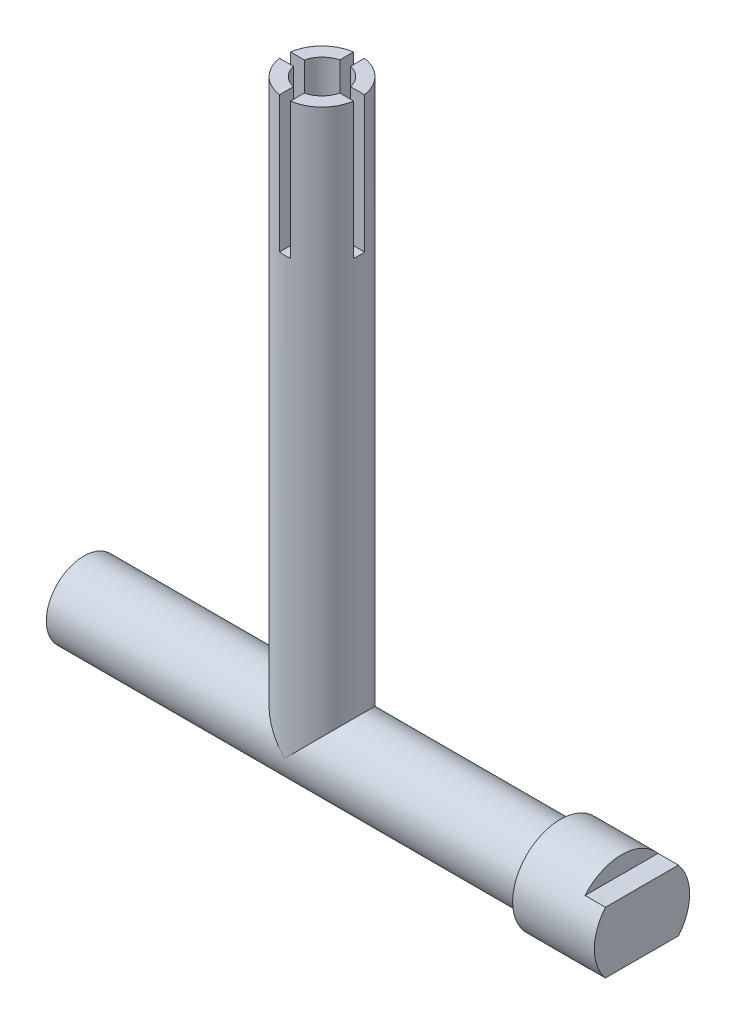
ISO-10303-21;
HEADER;
FILE_DESCRIPTION(('STEP AP214'),'2;1');
FILE_NAME('part.step','',(''),(''),'','','');
FILE_SCHEMA(('AUTOMOTIVE_DESIGN { 1 0 10303 214 1 1 1 1 }'));
ENDSEC;
DATA;
#1=APPLICATION_CONTEXT('core data for automotive mechanical design processes');
#2=APPLICATION_PROTOCOL_DEFINITION('international standard','automotive_design',2000,#1);
#3=PRODUCT_CONTEXT('',#1,'mechanical');
#4=PRODUCT('Part','Part','',(#3));
#5=PRODUCT_RELATED_PRODUCT_CATEGORY('part','',(#4));
#6=PRODUCT_DEFINITION_FORMATION('','',#4);
#7=PRODUCT_DEFINITION_CONTEXT('part definition',#1,'design');
#8=PRODUCT_DEFINITION('design','',#6,#7);
#9=PRODUCT_DEFINITION_SHAPE('','',#8);
#10=(LENGTH_UNIT() NAMED_UNIT(*) SI_UNIT(.MILLI.,.METRE.));
#11=(NAMED_UNIT(*) PLANE_ANGLE_UNIT() SI_UNIT($,.RADIAN.));
#12=(NAMED_UNIT(*) SI_UNIT($,.STERADIAN.) SOLID_ANGLE_UNIT());
#13=UNCERTAINTY_MEASURE_WITH_UNIT(LENGTH_MEASURE(1.E-05),#10,'distance_accuracy_value','');
#14=(GEOMETRIC_REPRESENTATION_CONTEXT(3) GLOBAL_UNCERTAINTY_ASSIGNED_CONTEXT((#13)) GLOBAL_UNIT_ASSIGNED_CONTEXT((#10,
#11,#12)) REPRESENTATION_CONTEXT('',''));
#15=CARTESIAN_POINT('',(0.,0.,0.));
#16=DIRECTION('',(0.,0.,1.));
#17=DIRECTION('',(1.,0.,0.));
#18=AXIS2_PLACEMENT_3D('',#15,#16,#17);
#19=CARTESIAN_POINT('',(41.,0.,0.));
#20=DIRECTION('',(-1.,0.,0.));
#21=DIRECTION('',(0.,0.,1.));
#22=AXIS2_PLACEMENT_3D('',#19,#20,#21);
#23=CYLINDRICAL_SURFACE('',#22,3.5);
#24=CARTESIAN_POINT('',(35.,0.,0.));
#25=DIRECTION('',(1.,0.,0.));
#26=DIRECTION('',(0.,0.,-1.));
#27=AXIS2_PLACEMENT_3D('',#24,#25,#26);
#28=CIRCLE('',#27,3.5);
#29=CARTESIAN_POINT('',(35.,0.,-3.5));
#30=VERTEX_POINT('',#29);
#31=EDGE_CURVE('E229',#30,#30,#28,.T.);
#32=ORIENTED_EDGE('',*,*,#31,.T.);
#33=EDGE_LOOP('',(#32));
#34=FACE_BOUND('',#33,.T.);
#35=DIRECTION('',(1.,0.,0.));
#36=VECTOR('',#35,1.);
#37=CARTESIAN_POINT('',(39.5,-2.25,2.6809513236909));
#38=LINE('',#37,#36);
#39=CARTESIAN_POINT('',(39.5,-2.25,2.6809513236909));
#40=VERTEX_POINT('',#39);
#41=CARTESIAN_POINT('',(41.,-2.25,2.6809513236909));
#42=VERTEX_POINT('',#41);
#43=EDGE_CURVE('E214',#40,#42,#38,.T.);
#44=ORIENTED_EDGE('',*,*,#43,.T.);
#45=CARTESIAN_POINT('',(41.,0.,0.));
#46=DIRECTION('',(1.,0.,0.));
#47=DIRECTION('',(0.,0.,-1.));
#48=AXIS2_PLACEMENT_3D('',#45,#46,#47);
#49=CIRCLE('',#48,3.5);
#50=CARTESIAN_POINT('',(41.,2.25,2.6809513236909));
#51=VERTEX_POINT('',#50);
#52=EDGE_CURVE('E231',#51,#42,#49,.T.);
#53=ORIENTED_EDGE('',*,*,#52,.F.);
#54=DIRECTION('',(1.,0.,0.));
#55=VECTOR('',#54,1.);
#56=CARTESIAN_POINT('',(39.5,2.25,2.6809513236909));
#57=LINE('',#56,#55);
#58=CARTESIAN_POINT('',(39.5,2.25,2.6809513236909));
#59=VERTEX_POINT('',#58);
#60=EDGE_CURVE('E61',#59,#51,#57,.T.);
#61=ORIENTED_EDGE('',*,*,#60,.F.);
#62=CARTESIAN_POINT('',(39.5,0.,0.));
#63=DIRECTION('',(1.,0.,0.));
#64=DIRECTION('',(0.,0.,-1.));
#65=AXIS2_PLACEMENT_3D('',#62,#63,#64);
#66=CIRCLE('',#65,3.5);
#67=CARTESIAN_POINT('',(39.5,2.25,-2.6809513236909));
#68=VERTEX_POINT('',#67);
#69=EDGE_CURVE('E220',#68,#59,#66,.T.);
#70=ORIENTED_EDGE('',*,*,#69,.F.);
#71=DIRECTION('',(1.,0.,0.));
#72=VECTOR('',#71,1.);
#73=CARTESIAN_POINT('',(39.5,2.25,-2.6809513236909));
#74=LINE('',#73,#72);
#75=CARTESIAN_POINT('',(41.,2.25,-2.6809513236909));
#76=VERTEX_POINT('',#75);
#77=EDGE_CURVE('E226',#68,#76,#74,.T.);
#78=ORIENTED_EDGE('',*,*,#77,.T.);
#79=CARTESIAN_POINT('',(41.,-2.25,-2.6809513236909));
#80=VERTEX_POINT('',#79);
#81=EDGE_CURVE('E235',#80,#76,#49,.T.);
#82=ORIENTED_EDGE('',*,*,#81,.F.);
#83=DIRECTION('',(1.,0.,0.));
#84=VECTOR('',#83,1.);
#85=CARTESIAN_POINT('',(39.5,-2.25,-2.6809513236909));
#86=LINE('',#85,#84);
#87=CARTESIAN_POINT('',(39.5,-2.25,-2.6809513236909));
#88=VERTEX_POINT('',#87);
#89=EDGE_CURVE('E53',#88,#80,#86,.T.);
#90=ORIENTED_EDGE('',*,*,#89,.F.);
#91=CARTESIAN_POINT('',(39.5,0.,0.));
#92=DIRECTION('',(1.,0.,0.));
#93=DIRECTION('',(0.,0.,-1.));
#94=AXIS2_PLACEMENT_3D('',#91,#92,#93);
#95=CIRCLE('',#94,3.5);
#96=EDGE_CURVE('E211',#40,#88,#95,.T.);
#97=ORIENTED_EDGE('',*,*,#96,.F.);
#98=EDGE_LOOP('',(#44,#53,#61,#70,#78,#82,#90,#97));
#99=FACE_BOUND('',#98,.T.);
#100=ADVANCED_FACE('F38',(#34,#99),#23,.T.);
#101=CARTESIAN_POINT('',(41.,0.,0.));
#102=DIRECTION('',(1.,0.,0.));
#103=DIRECTION('',(0.,0.,-1.));
#104=AXIS2_PLACEMENT_3D('',#101,#102,#103);
#105=PLANE('',#104);
#106=ORIENTED_EDGE('',*,*,#52,.T.);
#107=DIRECTION('',(0.,0.,-1.));
#108=VECTOR('',#107,1.);
#109=CARTESIAN_POINT('',(41.,-2.25,0.));
#110=LINE('',#109,#108);
#111=EDGE_CURVE('E207',#42,#80,#110,.T.);
#112=ORIENTED_EDGE('',*,*,#111,.T.);
#113=ORIENTED_EDGE('',*,*,#81,.T.);
#114=DIRECTION('',(0.,0.,-1.));
#115=VECTOR('',#114,1.);
#116=CARTESIAN_POINT('',(41.,2.25,0.));
#117=LINE('',#116,#115);
#118=EDGE_CURVE('E217',#51,#76,#117,.T.);
#119=ORIENTED_EDGE('',*,*,#118,.F.);
#120=EDGE_LOOP('',(#106,#112,#113,#119));
#121=FACE_BOUND('',#120,.T.);
#122=ADVANCED_FACE('F428',(#121),#105,.T.);
#123=CARTESIAN_POINT('',(17.5,42.,0.));
#124=DIRECTION('',(0.,-1.,0.));
#125=DIRECTION('',(0.,0.,-1.));
#126=AXIS2_PLACEMENT_3D('',#123,#124,#125);
#127=CYLINDRICAL_SURFACE('',#126,2.75);
#128=CARTESIAN_POINT('',(17.5,0.,0.));
#129=DIRECTION('',(-0.707106781186548,0.707106781186547,0.));
#130=DIRECTION('',(-0.707106781186548,-0.707106781186547,0.));
#131=AXIS2_PLACEMENT_3D('',#128,#129,#130);
#132=ELLIPSE('',#131,3.88908729652601,2.75);
#133=CARTESIAN_POINT('',(17.5,0.,2.75));
#134=VERTEX_POINT('',#133);
#135=CARTESIAN_POINT('',(17.5,0.,-2.75));
#136=VERTEX_POINT('',#135);
#137=EDGE_CURVE('E320',#134,#136,#132,.T.);
#138=ORIENTED_EDGE('',*,*,#137,.T.);
#139=CARTESIAN_POINT('',(17.5,0.,0.));
#140=DIRECTION('',(-0.707106781186548,-0.707106781186547,0.));
#141=DIRECTION('',(-0.707106781186548,0.707106781186547,0.));
#142=AXIS2_PLACEMENT_3D('',#139,#140,#141);
#143=ELLIPSE('',#142,3.88908729652601,2.75);
#144=EDGE_CURVE('E325',#136,#134,#143,.F.);
#145=ORIENTED_EDGE('',*,*,#144,.T.);
#146=EDGE_LOOP('',(#138,#145));
#147=FACE_BOUND('',#146,.T.);
#148=DIRECTION('',(0.,-1.,0.));
#149=VECTOR('',#148,1.);
#150=CARTESIAN_POINT('',(20.2207535720826,42.,-0.400000000000001));
#151=LINE('',#150,#149);
#152=CARTESIAN_POINT('',(20.2207535720826,32.,-0.400000000000018));
#153=VERTEX_POINT('',#152);
#154=CARTESIAN_POINT('',(20.2207535720826,42.,-0.400000000000001));
#155=VERTEX_POINT('',#154);
#156=EDGE_CURVE('E296',#153,#155,#151,.F.);
#157=ORIENTED_EDGE('',*,*,#156,.F.);
#158=CARTESIAN_POINT('',(17.5,32.,0.));
#159=DIRECTION('',(0.,1.,0.));
#160=DIRECTION('',(0.,0.,1.));
#161=AXIS2_PLACEMENT_3D('',#158,#159,#160);
#162=CIRCLE('',#161,2.75);
#163=CARTESIAN_POINT('',(20.2207535720826,32.,0.39999999999998));
#164=VERTEX_POINT('',#163);
#165=EDGE_CURVE('E282',#164,#153,#162,.T.);
#166=ORIENTED_EDGE('',*,*,#165,.F.);
#167=DIRECTION('',(0.,-1.,0.));
#168=VECTOR('',#167,1.);
#169=CARTESIAN_POINT('',(20.2207535720826,42.,0.399999999999998));
#170=LINE('',#169,#168);
#171=CARTESIAN_POINT('',(20.2207535720826,42.,0.399999999999998));
#172=VERTEX_POINT('',#171);
#173=EDGE_CURVE('E293',#164,#172,#170,.F.);
#174=ORIENTED_EDGE('',*,*,#173,.T.);
#175=CARTESIAN_POINT('',(17.5,42.,0.));
#176=DIRECTION('',(0.,1.,0.));
#177=DIRECTION('',(0.,0.,1.));
#178=AXIS2_PLACEMENT_3D('',#175,#176,#177);
#179=CIRCLE('',#178,2.75);
#180=CARTESIAN_POINT('',(17.9,42.0000000000001,2.72075357208256));
#181=VERTEX_POINT('',#180);
#182=EDGE_CURVE('E312',#181,#172,#179,.T.);
#183=ORIENTED_EDGE('',*,*,#182,.F.);
#184=DIRECTION('',(0.,-1.,0.));
#185=VECTOR('',#184,1.);
#186=CARTESIAN_POINT('',(17.9,42.0000000000001,2.72075357208255));
#187=LINE('',#186,#185);
#188=CARTESIAN_POINT('',(17.9,32.0000000000001,2.72075357208256));
#189=VERTEX_POINT('',#188);
#190=EDGE_CURVE('E290',#181,#189,#187,.T.);
#191=ORIENTED_EDGE('',*,*,#190,.T.);
#192=CARTESIAN_POINT('',(17.1,32.0000000000001,2.72075357208256));
#193=VERTEX_POINT('',#192);
#194=EDGE_CURVE('E261',#193,#189,#162,.T.);
#195=ORIENTED_EDGE('',*,*,#194,.F.);
#196=DIRECTION('',(0.,-1.,0.));
#197=VECTOR('',#196,1.);
#198=CARTESIAN_POINT('',(17.1,42.,2.72075357208255));
#199=LINE('',#198,#197);
#200=CARTESIAN_POINT('',(17.1,42.,2.72075357208255));
#201=VERTEX_POINT('',#200);
#202=EDGE_CURVE('E288',#201,#193,#199,.T.);
#203=ORIENTED_EDGE('',*,*,#202,.F.);
#204=CARTESIAN_POINT('',(14.7792464279174,42.0000000000001,0.399999999999998));
#205=VERTEX_POINT('',#204);
#206=EDGE_CURVE('E311',#205,#201,#179,.T.);
#207=ORIENTED_EDGE('',*,*,#206,.F.);
#208=DIRECTION('',(0.,-1.,0.));
#209=VECTOR('',#208,1.);
#210=CARTESIAN_POINT('',(14.7792464279174,42.0000000000001,0.399999999999998));
#211=LINE('',#210,#209);
#212=CARTESIAN_POINT('',(14.7792464279174,32.,0.39999999999998));
#213=VERTEX_POINT('',#212);
#214=EDGE_CURVE('E285',#205,#213,#211,.T.);
#215=ORIENTED_EDGE('',*,*,#214,.T.);
#216=CARTESIAN_POINT('',(14.7792464279174,32.,-0.400000000000018));
#217=VERTEX_POINT('',#216);
#218=EDGE_CURVE('E281',#217,#213,#162,.T.);
#219=ORIENTED_EDGE('',*,*,#218,.F.);
#220=DIRECTION('',(0.,-1.,0.));
#221=VECTOR('',#220,1.);
#222=CARTESIAN_POINT('',(14.7792464279174,42.0000000000001,-0.400000000000001));
#223=LINE('',#222,#221);
#224=CARTESIAN_POINT('',(14.7792464279174,42.0000000000001,-0.400000000000001));
#225=VERTEX_POINT('',#224);
#226=EDGE_CURVE('E283',#225,#217,#223,.T.);
#227=ORIENTED_EDGE('',*,*,#226,.F.);
#228=CARTESIAN_POINT('',(17.1,42.,-2.72075357208255));
#229=VERTEX_POINT('',#228);
#230=EDGE_CURVE('E395',#229,#225,#179,.T.);
#231=ORIENTED_EDGE('',*,*,#230,.F.);
#232=DIRECTION('',(0.,-1.,0.));
#233=VECTOR('',#232,1.);
#234=CARTESIAN_POINT('',(17.1,42.,-2.72075357208255));
#235=LINE('',#234,#233);
#236=CARTESIAN_POINT('',(17.1,32.,-2.72075357208256));
#237=VERTEX_POINT('',#236);
#238=EDGE_CURVE('E301',#237,#229,#235,.F.);
#239=ORIENTED_EDGE('',*,*,#238,.F.);
#240=CARTESIAN_POINT('',(17.9,32.,-2.72075357208256));
#241=VERTEX_POINT('',#240);
#242=EDGE_CURVE('E380',#241,#237,#162,.T.);
#243=ORIENTED_EDGE('',*,*,#242,.F.);
#244=DIRECTION('',(0.,-1.,0.));
#245=VECTOR('',#244,1.);
#246=CARTESIAN_POINT('',(17.9,42.0000000000001,-2.72075357208255));
#247=LINE('',#246,#245);
#248=CARTESIAN_POINT('',(17.9,42.0000000000001,-2.72075357208255));
#249=VERTEX_POINT('',#248);
#250=EDGE_CURVE('E298',#241,#249,#247,.F.);
#251=ORIENTED_EDGE('',*,*,#250,.T.);
#252=EDGE_CURVE('E316',#155,#249,#179,.T.);
#253=ORIENTED_EDGE('',*,*,#252,.F.);
#254=EDGE_LOOP('',(#157,#166,#174,#183,#191,#195,#203,#207,#215,#219,#227,#231,#239,#243,#251,#253));
#255=FACE_BOUND('',#254,.T.);
#256=ADVANCED_FACE('F378',(#147,#255),#127,.T.);
#257=CARTESIAN_POINT('',(17.5,42.,0.));
#258=DIRECTION('',(0.,1.,0.));
#259=DIRECTION('',(0.,0.,1.));
#260=AXIS2_PLACEMENT_3D('',#257,#258,#259);
#261=PLANE('',#260);
#262=CARTESIAN_POINT('',(17.5,42.,0.));
#263=DIRECTION('',(0.,1.,0.));
#264=DIRECTION('',(0.,0.,1.));
#265=AXIS2_PLACEMENT_3D('',#262,#263,#264);
#266=CIRCLE('',#265,1.75);
#267=CARTESIAN_POINT('',(17.1,42.,-1.70367250374007));
#268=VERTEX_POINT('',#267);
#269=CARTESIAN_POINT('',(15.7963274962599,42.0000000000001,-0.400000000000001));
#270=VERTEX_POINT('',#269);
#271=EDGE_CURVE('E746',#268,#270,#266,.T.);
#272=ORIENTED_EDGE('',*,*,#271,.F.);
#273=DIRECTION('',(0.,0.,-1.));
#274=VECTOR('',#273,1.);
#275=CARTESIAN_POINT('',(17.1,42.,0.));
#276=LINE('',#275,#274);
#277=EDGE_CURVE('E234',#268,#229,#276,.T.);
#278=ORIENTED_EDGE('',*,*,#277,.T.);
#279=ORIENTED_EDGE('',*,*,#230,.T.);
#280=DIRECTION('',(1.,0.,0.));
#281=VECTOR('',#280,1.);
#282=CARTESIAN_POINT('',(0.,42.,-0.400000000000015));
#283=LINE('',#282,#281);
#284=EDGE_CURVE('E264',#225,#270,#283,.T.);
#285=ORIENTED_EDGE('',*,*,#284,.T.);
#286=EDGE_LOOP('',(#272,#278,#279,#285));
#287=FACE_BOUND('',#286,.T.);
#288=ADVANCED_FACE('F482',(#287),#261,.T.);
#289=DIRECTION('',(0.,0.,-1.));
#290=VECTOR('',#289,1.);
#291=CARTESIAN_POINT('',(17.9,42.0000000000001,0.));
#292=LINE('',#291,#290);
#293=CARTESIAN_POINT('',(17.9,42.0000000000001,-1.70367250374008));
#294=VERTEX_POINT('',#293);
#295=EDGE_CURVE('E242',#294,#249,#292,.T.);
#296=ORIENTED_EDGE('',*,*,#295,.F.);
#297=CARTESIAN_POINT('',(19.2036725037401,42.,-0.400000000000001));
#298=VERTEX_POINT('',#297);
#299=EDGE_CURVE('E308',#298,#294,#266,.T.);
#300=ORIENTED_EDGE('',*,*,#299,.F.);
#301=DIRECTION('',(1.,0.,0.));
#302=VECTOR('',#301,1.);
#303=CARTESIAN_POINT('',(0.,42.,-0.400000000000015));
#304=LINE('',#303,#302);
#305=EDGE_CURVE('E276',#298,#155,#304,.T.);
#306=ORIENTED_EDGE('',*,*,#305,.T.);
#307=ORIENTED_EDGE('',*,*,#252,.T.);
#308=EDGE_LOOP('',(#296,#300,#306,#307));
#309=FACE_BOUND('',#308,.T.);
#310=ADVANCED_FACE('F402',(#309),#261,.T.);
#311=ORIENTED_EDGE('',*,*,#206,.T.);
#312=DIRECTION('',(0.,0.,-1.));
#313=VECTOR('',#312,1.);
#314=CARTESIAN_POINT('',(17.1,42.,0.));
#315=LINE('',#314,#313);
#316=CARTESIAN_POINT('',(17.1,42.,1.70367250374008));
#317=VERTEX_POINT('',#316);
#318=EDGE_CURVE('E269',#201,#317,#315,.T.);
#319=ORIENTED_EDGE('',*,*,#318,.T.);
#320=CARTESIAN_POINT('',(15.7963274962599,42.0000000000001,0.399999999999998));
#321=VERTEX_POINT('',#320);
#322=EDGE_CURVE('E303',#321,#317,#266,.T.);
#323=ORIENTED_EDGE('',*,*,#322,.F.);
#324=DIRECTION('',(1.,0.,0.));
#325=VECTOR('',#324,1.);
#326=CARTESIAN_POINT('',(0.,42.,0.399999999999984));
#327=LINE('',#326,#325);
#328=EDGE_CURVE('E267',#205,#321,#327,.T.);
#329=ORIENTED_EDGE('',*,*,#328,.F.);
#330=EDGE_LOOP('',(#311,#319,#323,#329));
#331=FACE_BOUND('',#330,.T.);
#332=ADVANCED_FACE('F491',(#331),#261,.T.);
#333=CARTESIAN_POINT('',(17.5,42.,0.));
#334=DIRECTION('',(0.,1.,0.));
#335=DIRECTION('',(0.,0.,1.));
#336=AXIS2_PLACEMENT_3D('',#333,#334,#335);
#337=CYLINDRICAL_SURFACE('',#336,1.75);
#338=CARTESIAN_POINT('',(17.5,32.,0.));
#339=DIRECTION('',(0.,1.,0.));
#340=DIRECTION('',(0.,0.,1.));
#341=AXIS2_PLACEMENT_3D('',#338,#339,#340);
#342=CIRCLE('',#341,1.75);
#343=CARTESIAN_POINT('',(15.7963274962599,32.,0.39999999999998));
#344=VERTEX_POINT('',#343);
#345=CARTESIAN_POINT('',(15.7963274962599,32.,-0.400000000000018));
#346=VERTEX_POINT('',#345);
#347=EDGE_CURVE('E331',#344,#346,#342,.F.);
#348=ORIENTED_EDGE('',*,*,#347,.F.);
#349=DIRECTION('',(0.,1.,0.));
#350=VECTOR('',#349,1.);
#351=CARTESIAN_POINT('',(15.7963274962599,42.0000000000001,0.399999999999998));
#352=LINE('',#351,#350);
#353=EDGE_CURVE('E11',#344,#321,#352,.T.);
#354=ORIENTED_EDGE('',*,*,#353,.T.);
#355=ORIENTED_EDGE('',*,*,#322,.T.);
#356=DIRECTION('',(0.,1.,0.));
#357=VECTOR('',#356,1.);
#358=CARTESIAN_POINT('',(17.1,42.,1.70367250374008));
#359=LINE('',#358,#357);
#360=CARTESIAN_POINT('',(17.1,32.,1.70367250374008));
#361=VERTEX_POINT('',#360);
#362=EDGE_CURVE('E330',#361,#317,#359,.T.);
#363=ORIENTED_EDGE('',*,*,#362,.F.);
#364=CARTESIAN_POINT('',(17.9,32.,1.70367250374008));
#365=VERTEX_POINT('',#364);
#366=EDGE_CURVE('E328',#365,#361,#342,.F.);
#367=ORIENTED_EDGE('',*,*,#366,.F.);
#368=DIRECTION('',(0.,1.,0.));
#369=VECTOR('',#368,1.);
#370=CARTESIAN_POINT('',(17.9,42.0000000000001,1.70367250374008));
#371=LINE('',#370,#369);
#372=CARTESIAN_POINT('',(17.9,42.0000000000001,1.70367250374008));
#373=VERTEX_POINT('',#372);
#374=EDGE_CURVE('E334',#365,#373,#371,.T.);
#375=ORIENTED_EDGE('',*,*,#374,.T.);
#376=CARTESIAN_POINT('',(19.2036725037401,42.,0.399999999999998));
#377=VERTEX_POINT('',#376);
#378=EDGE_CURVE('E304',#373,#377,#266,.T.);
#379=ORIENTED_EDGE('',*,*,#378,.T.);
#380=DIRECTION('',(0.,1.,0.));
#381=VECTOR('',#380,1.);
#382=CARTESIAN_POINT('',(19.2036725037401,42.,0.399999999999998));
#383=LINE('',#382,#381);
#384=CARTESIAN_POINT('',(19.2036725037401,32.,0.39999999999998));
#385=VERTEX_POINT('',#384);
#386=EDGE_CURVE('E337',#377,#385,#383,.F.);
#387=ORIENTED_EDGE('',*,*,#386,.T.);
#388=CARTESIAN_POINT('',(19.2036725037401,32.,-0.400000000000018));
#389=VERTEX_POINT('',#388);
#390=EDGE_CURVE('E332',#389,#385,#342,.F.);
#391=ORIENTED_EDGE('',*,*,#390,.F.);
#392=DIRECTION('',(0.,1.,0.));
#393=VECTOR('',#392,1.);
#394=CARTESIAN_POINT('',(19.2036725037401,42.,-0.400000000000001));
#395=LINE('',#394,#393);
#396=EDGE_CURVE('E340',#298,#389,#395,.F.);
#397=ORIENTED_EDGE('',*,*,#396,.F.);
#398=ORIENTED_EDGE('',*,*,#299,.T.);
#399=DIRECTION('',(0.,1.,0.));
#400=VECTOR('',#399,1.);
#401=CARTESIAN_POINT('',(17.9,42.0000000000001,-1.70367250374008));
#402=LINE('',#401,#400);
#403=CARTESIAN_POINT('',(17.9,32.,-1.70367250374008));
#404=VERTEX_POINT('',#403);
#405=EDGE_CURVE('E344',#294,#404,#402,.F.);
#406=ORIENTED_EDGE('',*,*,#405,.T.);
#407=CARTESIAN_POINT('',(17.1,32.,-1.70367250374008));
#408=VERTEX_POINT('',#407);
#409=EDGE_CURVE('E343',#408,#404,#342,.F.);
#410=ORIENTED_EDGE('',*,*,#409,.F.);
#411=DIRECTION('',(0.,1.,0.));
#412=VECTOR('',#411,1.);
#413=CARTESIAN_POINT('',(17.1,42.,-1.70367250374007));
#414=LINE('',#413,#412);
#415=EDGE_CURVE('E347',#268,#408,#414,.F.);
#416=ORIENTED_EDGE('',*,*,#415,.F.);
#417=ORIENTED_EDGE('',*,*,#271,.T.);
#418=DIRECTION('',(0.,1.,0.));
#419=VECTOR('',#418,1.);
#420=CARTESIAN_POINT('',(15.7963274962599,42.0000000000001,-0.400000000000001));
#421=LINE('',#420,#419);
#422=EDGE_CURVE('E46',#346,#270,#421,.T.);
#423=ORIENTED_EDGE('',*,*,#422,.F.);
#424=EDGE_LOOP('',(#348,#354,#355,#363,#367,#375,#379,#387,#391,#397,#398,#406,#410,#416,#417,#423));
#425=FACE_BOUND('',#424,.T.);
#426=CARTESIAN_POINT('',(17.5,28.9999999999999,0.));
#427=DIRECTION('',(0.,1.,0.));
#428=DIRECTION('',(0.,0.,1.));
#429=AXIS2_PLACEMENT_3D('',#426,#427,#428);
#430=CIRCLE('',#429,1.75);
#431=CARTESIAN_POINT('',(17.5,28.9999999999999,1.75));
#432=VERTEX_POINT('',#431);
#433=EDGE_CURVE('E307',#432,#432,#430,.T.);
#434=ORIENTED_EDGE('',*,*,#433,.F.);
#435=EDGE_LOOP('',(#434));
#436=FACE_BOUND('',#435,.T.);
#437=ADVANCED_FACE('F367',(#425,#436),#337,.F.);
#438=CARTESIAN_POINT('',(35.,0.,0.));
#439=DIRECTION('',(-1.,0.,0.));
#440=DIRECTION('',(0.,0.,1.));
#441=AXIS2_PLACEMENT_3D('',#438,#439,#440);
#442=CYLINDRICAL_SURFACE('',#441,2.75);
#443=CARTESIAN_POINT('',(0.,0.,0.));
#444=DIRECTION('',(1.,0.,0.));
#445=DIRECTION('',(0.,0.,-1.));
#446=AXIS2_PLACEMENT_3D('',#443,#444,#445);
#447=CIRCLE('',#446,2.75);
#448=CARTESIAN_POINT('',(0.,0.,-2.75));
#449=VERTEX_POINT('',#448);
#450=EDGE_CURVE('E315',#449,#449,#447,.T.);
#451=ORIENTED_EDGE('',*,*,#450,.T.);
#452=EDGE_LOOP('',(#451));
#453=FACE_BOUND('',#452,.T.);
#454=CARTESIAN_POINT('',(35.,0.,0.));
#455=DIRECTION('',(1.,0.,0.));
#456=DIRECTION('',(0.,0.,-1.));
#457=AXIS2_PLACEMENT_3D('',#454,#455,#456);
#458=CIRCLE('',#457,2.75);
#459=CARTESIAN_POINT('',(35.,0.,-2.75));
#460=VERTEX_POINT('',#459);
#461=EDGE_CURVE('E317',#460,#460,#458,.T.);
#462=ORIENTED_EDGE('',*,*,#461,.F.);
#463=EDGE_LOOP('',(#462));
#464=FACE_BOUND('',#463,.T.);
#465=ORIENTED_EDGE('',*,*,#144,.F.);
#466=ORIENTED_EDGE('',*,*,#137,.F.);
#467=EDGE_LOOP('',(#465,#466));
#468=FACE_BOUND('',#467,.T.);
#469=ADVANCED_FACE('F40',(#453,#464,#468),#442,.T.);
#470=CARTESIAN_POINT('',(0.,0.,0.));
#471=DIRECTION('',(1.,0.,0.));
#472=DIRECTION('',(0.,0.,-1.));
#473=AXIS2_PLACEMENT_3D('',#470,#471,#472);
#474=PLANE('',#473);
#475=CARTESIAN_POINT('',(0.,0.,0.));
#476=DIRECTION('',(-1.,0.,0.));
#477=DIRECTION('',(0.,0.,1.));
#478=AXIS2_PLACEMENT_3D('',#475,#476,#477);
#479=CIRCLE('',#478,2.);
#480=CARTESIAN_POINT('',(0.,0.,2.));
#481=VERTEX_POINT('',#480);
#482=EDGE_CURVE('E197',#481,#481,#479,.T.);
#483=ORIENTED_EDGE('',*,*,#482,.F.);
#484=EDGE_LOOP('',(#483));
#485=FACE_BOUND('',#484,.T.);
#486=ORIENTED_EDGE('',*,*,#450,.F.);
#487=EDGE_LOOP('',(#486));
#488=FACE_BOUND('',#487,.T.);
#489=ADVANCED_FACE('F471',(#485,#488),#474,.F.);
#490=DIRECTION('',(1.,0.,0.));
#491=VECTOR('',#490,1.);
#492=CARTESIAN_POINT('',(0.,42.,0.399999999999984));
#493=LINE('',#492,#491);
#494=EDGE_CURVE('E274',#377,#172,#493,.T.);
#495=ORIENTED_EDGE('',*,*,#494,.F.);
#496=ORIENTED_EDGE('',*,*,#378,.F.);
#497=DIRECTION('',(0.,0.,-1.));
#498=VECTOR('',#497,1.);
#499=CARTESIAN_POINT('',(17.9,42.0000000000001,0.));
#500=LINE('',#499,#498);
#501=EDGE_CURVE('E272',#181,#373,#500,.T.);
#502=ORIENTED_EDGE('',*,*,#501,.F.);
#503=ORIENTED_EDGE('',*,*,#182,.T.);
#504=EDGE_LOOP('',(#495,#496,#502,#503));
#505=FACE_BOUND('',#504,.T.);
#506=ADVANCED_FACE('F374',(#505),#261,.T.);
#507=CARTESIAN_POINT('',(17.5,28.9999999999999,0.));
#508=DIRECTION('',(0.,1.,0.));
#509=DIRECTION('',(0.,0.,1.));
#510=AXIS2_PLACEMENT_3D('',#507,#508,#509);
#511=CONICAL_SURFACE('',#510,1.75,1.02974425867665);
#512=CARTESIAN_POINT('',(17.5,27.9484939167017,0.));
#513=VERTEX_POINT('',#512);
#514=VERTEX_LOOP('',#513);
#515=FACE_BOUND('',#514,.T.);
#516=ORIENTED_EDGE('',*,*,#433,.T.);
#517=EDGE_LOOP('',(#516));
#518=FACE_BOUND('',#517,.T.);
#519=ADVANCED_FACE('F490',(#515,#518),#511,.F.);
#520=CARTESIAN_POINT('',(0.,32.,0.));
#521=DIRECTION('',(0.,1.,0.));
#522=DIRECTION('',(0.,0.,1.));
#523=AXIS2_PLACEMENT_3D('',#520,#521,#522);
#524=PLANE('',#523);
#525=ORIENTED_EDGE('',*,*,#194,.T.);
#526=DIRECTION('',(0.,0.,-1.));
#527=VECTOR('',#526,1.);
#528=CARTESIAN_POINT('',(17.9,32.,0.));
#529=LINE('',#528,#527);
#530=EDGE_CURVE('E250',#189,#365,#529,.T.);
#531=ORIENTED_EDGE('',*,*,#530,.T.);
#532=ORIENTED_EDGE('',*,*,#366,.T.);
#533=DIRECTION('',(0.,0.,-1.));
#534=VECTOR('',#533,1.);
#535=CARTESIAN_POINT('',(17.1,32.,0.));
#536=LINE('',#535,#534);
#537=EDGE_CURVE('E247',#193,#361,#536,.T.);
#538=ORIENTED_EDGE('',*,*,#537,.F.);
#539=EDGE_LOOP('',(#525,#531,#532,#538));
#540=FACE_BOUND('',#539,.T.);
#541=ADVANCED_FACE('F424',(#540),#524,.T.);
#542=CARTESIAN_POINT('',(17.1,32.,0.));
#543=DIRECTION('',(1.,0.,0.));
#544=DIRECTION('',(0.,0.,-1.));
#545=AXIS2_PLACEMENT_3D('',#542,#543,#544);
#546=PLANE('',#545);
#547=ORIENTED_EDGE('',*,*,#202,.T.);
#548=ORIENTED_EDGE('',*,*,#537,.T.);
#549=ORIENTED_EDGE('',*,*,#362,.T.);
#550=ORIENTED_EDGE('',*,*,#318,.F.);
#551=EDGE_LOOP('',(#547,#548,#549,#550));
#552=FACE_BOUND('',#551,.T.);
#553=ADVANCED_FACE('F504',(#552),#546,.T.);
#554=CARTESIAN_POINT('',(17.9,32.,0.));
#555=DIRECTION('',(1.,0.,0.));
#556=DIRECTION('',(0.,0.,-1.));
#557=AXIS2_PLACEMENT_3D('',#554,#555,#556);
#558=PLANE('',#557);
#559=ORIENTED_EDGE('',*,*,#501,.T.);
#560=ORIENTED_EDGE('',*,*,#374,.F.);
#561=ORIENTED_EDGE('',*,*,#530,.F.);
#562=ORIENTED_EDGE('',*,*,#190,.F.);
#563=EDGE_LOOP('',(#559,#560,#561,#562));
#564=FACE_BOUND('',#563,.T.);
#565=ADVANCED_FACE('F426',(#564),#558,.F.);
#566=ORIENTED_EDGE('',*,*,#165,.T.);
#567=DIRECTION('',(1.,0.,0.));
#568=VECTOR('',#567,1.);
#569=CARTESIAN_POINT('',(0.,32.,-0.400000000000018));
#570=LINE('',#569,#568);
#571=EDGE_CURVE('E255',#389,#153,#570,.T.);
#572=ORIENTED_EDGE('',*,*,#571,.F.);
#573=ORIENTED_EDGE('',*,*,#390,.T.);
#574=DIRECTION('',(1.,0.,0.));
#575=VECTOR('',#574,1.);
#576=CARTESIAN_POINT('',(0.,32.,0.39999999999998));
#577=LINE('',#576,#575);
#578=EDGE_CURVE('E252',#385,#164,#577,.T.);
#579=ORIENTED_EDGE('',*,*,#578,.T.);
#580=EDGE_LOOP('',(#566,#572,#573,#579));
#581=FACE_BOUND('',#580,.T.);
#582=ADVANCED_FACE('F360',(#581),#524,.T.);
#583=CARTESIAN_POINT('',(0.,32.,0.39999999999998));
#584=DIRECTION('',(0.,0.,1.));
#585=DIRECTION('',(1.,0.,0.));
#586=AXIS2_PLACEMENT_3D('',#583,#584,#585);
#587=PLANE('',#586);
#588=ORIENTED_EDGE('',*,*,#578,.F.);
#589=ORIENTED_EDGE('',*,*,#386,.F.);
#590=ORIENTED_EDGE('',*,*,#494,.T.);
#591=ORIENTED_EDGE('',*,*,#173,.F.);
#592=EDGE_LOOP('',(#588,#589,#590,#591));
#593=FACE_BOUND('',#592,.T.);
#594=ADVANCED_FACE('F365',(#593),#587,.F.);
#595=CARTESIAN_POINT('',(0.,32.,-0.400000000000018));
#596=DIRECTION('',(0.,0.,1.));
#597=DIRECTION('',(1.,0.,0.));
#598=AXIS2_PLACEMENT_3D('',#595,#596,#597);
#599=PLANE('',#598);
#600=ORIENTED_EDGE('',*,*,#156,.T.);
#601=ORIENTED_EDGE('',*,*,#305,.F.);
#602=ORIENTED_EDGE('',*,*,#396,.T.);
#603=ORIENTED_EDGE('',*,*,#571,.T.);
#604=EDGE_LOOP('',(#600,#601,#602,#603));
#605=FACE_BOUND('',#604,.T.);
#606=ADVANCED_FACE('F410',(#605),#599,.T.);
#607=ORIENTED_EDGE('',*,*,#242,.T.);
#608=DIRECTION('',(0.,0.,-1.));
#609=VECTOR('',#608,1.);
#610=CARTESIAN_POINT('',(17.1,32.,0.));
#611=LINE('',#610,#609);
#612=EDGE_CURVE('E238',#408,#237,#611,.T.);
#613=ORIENTED_EDGE('',*,*,#612,.F.);
#614=ORIENTED_EDGE('',*,*,#409,.T.);
#615=DIRECTION('',(0.,0.,-1.));
#616=VECTOR('',#615,1.);
#617=CARTESIAN_POINT('',(17.9,32.,0.));
#618=LINE('',#617,#616);
#619=EDGE_CURVE('E258',#404,#241,#618,.T.);
#620=ORIENTED_EDGE('',*,*,#619,.T.);
#621=EDGE_LOOP('',(#607,#613,#614,#620));
#622=FACE_BOUND('',#621,.T.);
#623=ADVANCED_FACE('F408',(#622),#524,.T.);
#624=CARTESIAN_POINT('',(17.9,32.,0.));
#625=DIRECTION('',(1.,0.,0.));
#626=DIRECTION('',(0.,0.,-1.));
#627=AXIS2_PLACEMENT_3D('',#624,#625,#626);
#628=PLANE('',#627);
#629=ORIENTED_EDGE('',*,*,#619,.F.);
#630=ORIENTED_EDGE('',*,*,#405,.F.);
#631=ORIENTED_EDGE('',*,*,#295,.T.);
#632=ORIENTED_EDGE('',*,*,#250,.F.);
#633=EDGE_LOOP('',(#629,#630,#631,#632));
#634=FACE_BOUND('',#633,.T.);
#635=ADVANCED_FACE('F407',(#634),#628,.F.);
#636=CARTESIAN_POINT('',(17.1,32.,0.));
#637=DIRECTION('',(1.,0.,0.));
#638=DIRECTION('',(0.,0.,-1.));
#639=AXIS2_PLACEMENT_3D('',#636,#637,#638);
#640=PLANE('',#639);
#641=ORIENTED_EDGE('',*,*,#238,.T.);
#642=ORIENTED_EDGE('',*,*,#277,.F.);
#643=ORIENTED_EDGE('',*,*,#415,.T.);
#644=ORIENTED_EDGE('',*,*,#612,.T.);
#645=EDGE_LOOP('',(#641,#642,#643,#644));
#646=FACE_BOUND('',#645,.T.);
#647=ADVANCED_FACE('F416',(#646),#640,.T.);
#648=CARTESIAN_POINT('',(0.,32.,0.39999999999998));
#649=DIRECTION('',(0.,0.,1.));
#650=DIRECTION('',(1.,0.,0.));
#651=AXIS2_PLACEMENT_3D('',#648,#649,#650);
#652=PLANE('',#651);
#653=ORIENTED_EDGE('',*,*,#328,.T.);
#654=ORIENTED_EDGE('',*,*,#353,.F.);
#655=DIRECTION('',(1.,0.,0.));
#656=VECTOR('',#655,1.);
#657=CARTESIAN_POINT('',(0.,32.,0.39999999999998));
#658=LINE('',#657,#656);
#659=EDGE_CURVE('E245',#213,#344,#658,.T.);
#660=ORIENTED_EDGE('',*,*,#659,.F.);
#661=ORIENTED_EDGE('',*,*,#214,.F.);
#662=EDGE_LOOP('',(#653,#654,#660,#661));
#663=FACE_BOUND('',#662,.T.);
#664=ADVANCED_FACE('F388',(#663),#652,.F.);
#665=CARTESIAN_POINT('',(0.,32.,-0.400000000000018));
#666=DIRECTION('',(0.,0.,1.));
#667=DIRECTION('',(1.,0.,0.));
#668=AXIS2_PLACEMENT_3D('',#665,#666,#667);
#669=PLANE('',#668);
#670=ORIENTED_EDGE('',*,*,#226,.T.);
#671=DIRECTION('',(1.,0.,0.));
#672=VECTOR('',#671,1.);
#673=CARTESIAN_POINT('',(0.,32.,-0.400000000000018));
#674=LINE('',#673,#672);
#675=EDGE_CURVE('E241',#217,#346,#674,.T.);
#676=ORIENTED_EDGE('',*,*,#675,.T.);
#677=ORIENTED_EDGE('',*,*,#422,.T.);
#678=ORIENTED_EDGE('',*,*,#284,.F.);
#679=EDGE_LOOP('',(#670,#676,#677,#678));
#680=FACE_BOUND('',#679,.T.);
#681=ADVANCED_FACE('F423',(#680),#669,.T.);
#682=ORIENTED_EDGE('',*,*,#218,.T.);
#683=ORIENTED_EDGE('',*,*,#659,.T.);
#684=ORIENTED_EDGE('',*,*,#347,.T.);
#685=ORIENTED_EDGE('',*,*,#675,.F.);
#686=EDGE_LOOP('',(#682,#683,#684,#685));
#687=FACE_BOUND('',#686,.T.);
#688=ADVANCED_FACE('F384',(#687),#524,.T.);
#689=CARTESIAN_POINT('',(35.,0.,0.));
#690=DIRECTION('',(1.,0.,0.));
#691=DIRECTION('',(0.,0.,-1.));
#692=AXIS2_PLACEMENT_3D('',#689,#690,#691);
#693=PLANE('',#692);
#694=ORIENTED_EDGE('',*,*,#31,.F.);
#695=EDGE_LOOP('',(#694));
#696=FACE_BOUND('',#695,.T.);
#697=ORIENTED_EDGE('',*,*,#461,.T.);
#698=EDGE_LOOP('',(#697));
#699=FACE_BOUND('',#698,.T.);
#700=ADVANCED_FACE('F422',(#696,#699),#693,.F.);
#701=CARTESIAN_POINT('',(39.5,2.25,0.));
#702=DIRECTION('',(0.,-1.,0.));
#703=DIRECTION('',(0.,0.,-1.));
#704=AXIS2_PLACEMENT_3D('',#701,#702,#703);
#705=PLANE('',#704);
#706=ORIENTED_EDGE('',*,*,#118,.T.);
#707=ORIENTED_EDGE('',*,*,#77,.F.);
#708=DIRECTION('',(0.,0.,-1.));
#709=VECTOR('',#708,1.);
#710=CARTESIAN_POINT('',(39.5,2.25,0.));
#711=LINE('',#710,#709);
#712=EDGE_CURVE('E222',#59,#68,#711,.T.);
#713=ORIENTED_EDGE('',*,*,#712,.F.);
#714=ORIENTED_EDGE('',*,*,#60,.T.);
#715=EDGE_LOOP('',(#706,#707,#713,#714));
#716=FACE_BOUND('',#715,.T.);
#717=ADVANCED_FACE('F438',(#716),#705,.F.);
#718=CARTESIAN_POINT('',(39.5,0.,0.));
#719=DIRECTION('',(1.,0.,0.));
#720=DIRECTION('',(0.,0.,-1.));
#721=AXIS2_PLACEMENT_3D('',#718,#719,#720);
#722=PLANE('',#721);
#723=ORIENTED_EDGE('',*,*,#69,.T.);
#724=ORIENTED_EDGE('',*,*,#712,.T.);
#725=EDGE_LOOP('',(#723,#724));
#726=FACE_BOUND('',#725,.T.);
#727=ADVANCED_FACE('F443',(#726),#722,.T.);
#728=CARTESIAN_POINT('',(39.5,-2.25,0.));
#729=DIRECTION('',(0.,-1.,0.));
#730=DIRECTION('',(0.,0.,-1.));
#731=AXIS2_PLACEMENT_3D('',#728,#729,#730);
#732=PLANE('',#731);
#733=ORIENTED_EDGE('',*,*,#111,.F.);
#734=ORIENTED_EDGE('',*,*,#43,.F.);
#735=DIRECTION('',(0.,0.,-1.));
#736=VECTOR('',#735,1.);
#737=CARTESIAN_POINT('',(39.5,-2.25,0.));
#738=LINE('',#737,#736);
#739=EDGE_CURVE('E209',#40,#88,#738,.T.);
#740=ORIENTED_EDGE('',*,*,#739,.T.);
#741=ORIENTED_EDGE('',*,*,#89,.T.);
#742=EDGE_LOOP('',(#733,#734,#740,#741));
#743=FACE_BOUND('',#742,.T.);
#744=ADVANCED_FACE('F446',(#743),#732,.T.);
#745=CARTESIAN_POINT('',(39.5,0.,0.));
#746=DIRECTION('',(1.,0.,0.));
#747=DIRECTION('',(0.,0.,-1.));
#748=AXIS2_PLACEMENT_3D('',#745,#746,#747);
#749=PLANE('',#748);
#750=ORIENTED_EDGE('',*,*,#739,.F.);
#751=ORIENTED_EDGE('',*,*,#96,.T.);
#752=EDGE_LOOP('',(#750,#751));
#753=FACE_BOUND('',#752,.T.);
#754=ADVANCED_FACE('F450',(#753),#749,.T.);
#755=CARTESIAN_POINT('',(6.99999999999999,0.,0.));
#756=DIRECTION('',(-1.,0.,0.));
#757=DIRECTION('',(0.,0.,1.));
#758=AXIS2_PLACEMENT_3D('',#755,#756,#757);
#759=CYLINDRICAL_SURFACE('',#758,2.);
#760=CARTESIAN_POINT('',(6.99999999999999,0.,0.));
#761=DIRECTION('',(-1.,0.,0.));
#762=DIRECTION('',(0.,0.,1.));
#763=AXIS2_PLACEMENT_3D('',#760,#761,#762);
#764=CIRCLE('',#763,2.);
#765=CARTESIAN_POINT('',(6.99999999999999,0.,2.));
#766=VERTEX_POINT('',#765);
#767=EDGE_CURVE('E201',#766,#766,#764,.T.);
#768=ORIENTED_EDGE('',*,*,#767,.F.);
#769=EDGE_LOOP('',(#768));
#770=FACE_BOUND('',#769,.T.);
#771=ORIENTED_EDGE('',*,*,#482,.T.);
#772=EDGE_LOOP('',(#771));
#773=FACE_BOUND('',#772,.T.);
#774=ADVANCED_FACE('F453',(#770,#773),#759,.F.);
#775=CARTESIAN_POINT('',(6.99999999999999,0.,0.));
#776=DIRECTION('',(-1.,0.,0.));
#777=DIRECTION('',(0.,0.,1.));
#778=AXIS2_PLACEMENT_3D('',#775,#776,#777);
#779=PLANE('',#778);
#780=CARTESIAN_POINT('',(6.99999999999999,0.,0.));
#781=DIRECTION('',(-1.,0.,0.));
#782=DIRECTION('',(0.,0.,1.));
#783=AXIS2_PLACEMENT_3D('',#780,#781,#782);
#784=CIRCLE('',#783,1.025);
#785=CARTESIAN_POINT('',(6.99999999999999,0.,1.025));
#786=VERTEX_POINT('',#785);
#787=EDGE_CURVE('E198',#786,#786,#784,.T.);
#788=ORIENTED_EDGE('',*,*,#787,.F.);
#789=EDGE_LOOP('',(#788));
#790=FACE_BOUND('',#789,.T.);
#791=ORIENTED_EDGE('',*,*,#767,.T.);
#792=EDGE_LOOP('',(#791));
#793=FACE_BOUND('',#792,.T.);
#794=ADVANCED_FACE('F191',(#790,#793),#779,.T.);
#795=CARTESIAN_POINT('',(13.,0.,0.));
#796=DIRECTION('',(-1.,0.,0.));
#797=DIRECTION('',(0.,0.,1.));
#798=AXIS2_PLACEMENT_3D('',#795,#796,#797);
#799=CONICAL_SURFACE('',#798,1.025,1.02974425867665);
#800=CARTESIAN_POINT('',(13.6158821345032,0.,0.));
#801=VERTEX_POINT('',#800);
#802=VERTEX_LOOP('',#801);
#803=FACE_BOUND('',#802,.T.);
#804=CARTESIAN_POINT('',(13.,0.,0.));
#805=DIRECTION('',(-1.,0.,0.));
#806=DIRECTION('',(0.,0.,1.));
#807=AXIS2_PLACEMENT_3D('',#804,#805,#806);
#808=CIRCLE('',#807,1.025);
#809=CARTESIAN_POINT('',(13.,0.,1.025));
#810=VERTEX_POINT('',#809);
#811=EDGE_CURVE('E195',#810,#810,#808,.T.);
#812=ORIENTED_EDGE('',*,*,#811,.T.);
#813=EDGE_LOOP('',(#812));
#814=FACE_BOUND('',#813,.T.);
#815=ADVANCED_FACE('F187',(#803,#814),#799,.F.);
#816=CARTESIAN_POINT('',(6.99999999999999,0.,0.));
#817=DIRECTION('',(-1.,0.,0.));
#818=DIRECTION('',(0.,0.,1.));
#819=AXIS2_PLACEMENT_3D('',#816,#817,#818);
#820=CYLINDRICAL_SURFACE('',#819,1.025);
#821=ORIENTED_EDGE('',*,*,#811,.F.);
#822=EDGE_LOOP('',(#821));
#823=FACE_BOUND('',#822,.T.);
#824=ORIENTED_EDGE('',*,*,#787,.T.);
#825=EDGE_LOOP('',(#824));
#826=FACE_BOUND('',#825,.T.);
#827=ADVANCED_FACE('F190',(#823,#826),#820,.F.);
#828=CLOSED_SHELL('',(#100,#122,#256,#288,#310,#332,#437,#469,#489,#506,#519,#541,#553,#565,
#582,#594,#606,#623,#635,#647,#664,#681,#688,#700,#717,#727,#744,#754,#774,#794,#815,#827));
#829=MANIFOLD_SOLID_BREP('B2',#828);
#830=ADVANCED_BREP_SHAPE_REPRESENTATION('',(#18,#829),#14);
#831=SHAPE_DEFINITION_REPRESENTATION(#9,#830);
ENDSEC;
END-ISO-10303-21;
